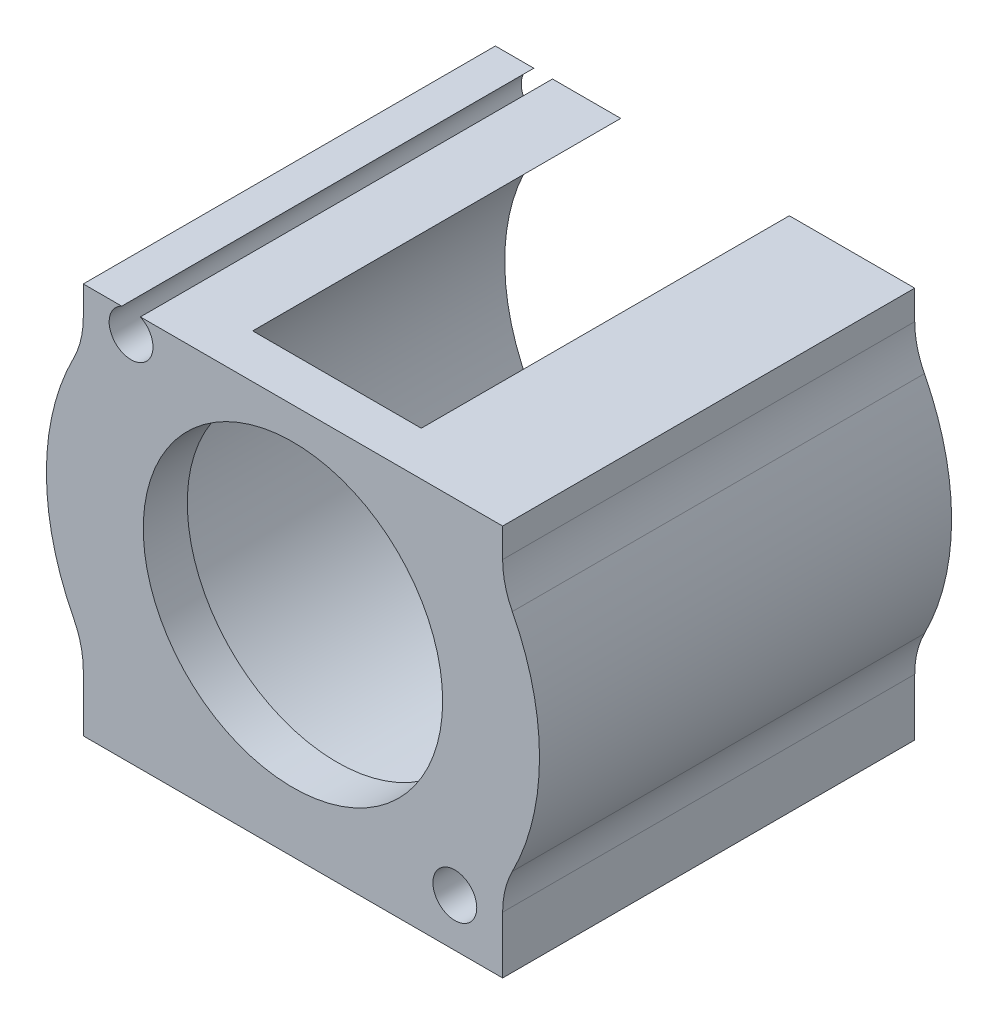
ISO-10303-21;
HEADER;
FILE_DESCRIPTION(('STEP AP214'),'2;1');
FILE_NAME('part.step','',(''),(''),'','','');
FILE_SCHEMA(('AUTOMOTIVE_DESIGN { 1 0 10303 214 1 1 1 1 }'));
ENDSEC;
DATA;
#1=APPLICATION_CONTEXT('core data for automotive mechanical design processes');
#2=APPLICATION_PROTOCOL_DEFINITION('international standard','automotive_design',2000,#1);
#3=PRODUCT_CONTEXT('',#1,'mechanical');
#4=PRODUCT('Part','Part','',(#3));
#5=PRODUCT_RELATED_PRODUCT_CATEGORY('part','',(#4));
#6=PRODUCT_DEFINITION_FORMATION('','',#4);
#7=PRODUCT_DEFINITION_CONTEXT('part definition',#1,'design');
#8=PRODUCT_DEFINITION('design','',#6,#7);
#9=PRODUCT_DEFINITION_SHAPE('','',#8);
#10=(LENGTH_UNIT() NAMED_UNIT(*) SI_UNIT(.MILLI.,.METRE.));
#11=(NAMED_UNIT(*) PLANE_ANGLE_UNIT() SI_UNIT($,.RADIAN.));
#12=(NAMED_UNIT(*) SI_UNIT($,.STERADIAN.) SOLID_ANGLE_UNIT());
#13=UNCERTAINTY_MEASURE_WITH_UNIT(LENGTH_MEASURE(1.E-05),#10,'distance_accuracy_value','');
#14=(GEOMETRIC_REPRESENTATION_CONTEXT(3) GLOBAL_UNCERTAINTY_ASSIGNED_CONTEXT((#13)) GLOBAL_UNIT_ASSIGNED_CONTEXT((#10,
#11,#12)) REPRESENTATION_CONTEXT('',''));
#15=CARTESIAN_POINT('',(0.,0.,0.));
#16=DIRECTION('',(0.,0.,1.));
#17=DIRECTION('',(1.,0.,0.));
#18=AXIS2_PLACEMENT_3D('',#15,#16,#17);
#19=CARTESIAN_POINT('',(0.,0.,46.8));
#20=DIRECTION('',(0.,0.,-1.));
#21=DIRECTION('',(-1.,0.,0.));
#22=AXIS2_PLACEMENT_3D('',#19,#20,#21);
#23=CYLINDRICAL_SURFACE('',#22,22.75);
#24=DIRECTION('',(0.,0.,-1.));
#25=VECTOR('',#24,1.);
#26=CARTESIAN_POINT('',(-9.57371890907607,20.6375,46.8));
#27=LINE('',#26,#25);
#28=CARTESIAN_POINT('',(-9.57371890907607,20.6375,41.8));
#29=VERTEX_POINT('',#28);
#30=CARTESIAN_POINT('',(-9.57371890907607,20.6375,0.));
#31=VERTEX_POINT('',#30);
#32=EDGE_CURVE('E164',#29,#31,#27,.T.);
#33=ORIENTED_EDGE('',*,*,#32,.F.);
#34=CARTESIAN_POINT('',(0.,0.,41.8));
#35=DIRECTION('',(0.,0.,1.));
#36=DIRECTION('',(1.,0.,0.));
#37=AXIS2_PLACEMENT_3D('',#34,#35,#36);
#38=CIRCLE('',#37,22.75);
#39=CARTESIAN_POINT('',(9.57371890907606,20.6375,41.8));
#40=VERTEX_POINT('',#39);
#41=EDGE_CURVE('E152',#29,#40,#38,.T.);
#42=ORIENTED_EDGE('',*,*,#41,.T.);
#43=DIRECTION('',(0.,0.,-1.));
#44=VECTOR('',#43,1.);
#45=CARTESIAN_POINT('',(9.57371890907606,20.6375,46.8));
#46=LINE('',#45,#44);
#47=CARTESIAN_POINT('',(9.57371890907606,20.6375,0.));
#48=VERTEX_POINT('',#47);
#49=EDGE_CURVE('E162',#48,#40,#46,.F.);
#50=ORIENTED_EDGE('',*,*,#49,.F.);
#51=CARTESIAN_POINT('',(0.,0.,0.));
#52=DIRECTION('',(0.,0.,1.));
#53=DIRECTION('',(1.,0.,0.));
#54=AXIS2_PLACEMENT_3D('',#51,#52,#53);
#55=CIRCLE('',#54,22.75);
#56=EDGE_CURVE('E190',#31,#48,#55,.T.);
#57=ORIENTED_EDGE('',*,*,#56,.F.);
#58=EDGE_LOOP('',(#33,#42,#50,#57));
#59=FACE_BOUND('',#58,.T.);
#60=ADVANCED_FACE('F39',(#59),#23,.F.);
#61=CARTESIAN_POINT('',(23.8125,-23.8125,46.8));
#62=DIRECTION('',(-1.,0.,0.));
#63=DIRECTION('',(0.,0.,1.));
#64=AXIS2_PLACEMENT_3D('',#61,#62,#63);
#65=PLANE('',#64);
#66=DIRECTION('',(0.,1.,0.));
#67=VECTOR('',#66,1.);
#68=CARTESIAN_POINT('',(23.8125,-23.8125,0.));
#69=LINE('',#68,#67);
#70=CARTESIAN_POINT('',(23.8125,-23.8125,0.));
#71=VERTEX_POINT('',#70);
#72=CARTESIAN_POINT('',(23.8125,-17.3411315590996,0.));
#73=VERTEX_POINT('',#72);
#74=EDGE_CURVE('E209',#71,#73,#69,.T.);
#75=ORIENTED_EDGE('',*,*,#74,.T.);
#76=DIRECTION('',(0.,0.,1.));
#77=VECTOR('',#76,1.);
#78=CARTESIAN_POINT('',(23.8125,-17.3411315590996,46.8));
#79=LINE('',#78,#77);
#80=CARTESIAN_POINT('',(23.8125,-17.3411315590996,46.8));
#81=VERTEX_POINT('',#80);
#82=EDGE_CURVE('E226',#73,#81,#79,.T.);
#83=ORIENTED_EDGE('',*,*,#82,.T.);
#84=DIRECTION('',(0.,1.,0.));
#85=VECTOR('',#84,1.);
#86=CARTESIAN_POINT('',(23.8125,-23.8125,46.8));
#87=LINE('',#86,#85);
#88=CARTESIAN_POINT('',(23.8125,-23.8125,46.8));
#89=VERTEX_POINT('',#88);
#90=EDGE_CURVE('E203',#89,#81,#87,.T.);
#91=ORIENTED_EDGE('',*,*,#90,.F.);
#92=DIRECTION('',(0.,0.,-1.));
#93=VECTOR('',#92,1.);
#94=CARTESIAN_POINT('',(23.8125,-23.8125,46.8));
#95=LINE('',#94,#93);
#96=EDGE_CURVE('E204',#89,#71,#95,.T.);
#97=ORIENTED_EDGE('',*,*,#96,.T.);
#98=EDGE_LOOP('',(#75,#83,#91,#97));
#99=FACE_BOUND('',#98,.T.);
#100=ADVANCED_FACE('F330',(#99),#65,.F.);
#101=CARTESIAN_POINT('',(-23.8125,-23.8125,46.8));
#102=DIRECTION('',(1.,0.,0.));
#103=DIRECTION('',(0.,0.,-1.));
#104=AXIS2_PLACEMENT_3D('',#101,#102,#103);
#105=PLANE('',#104);
#106=DIRECTION('',(0.,-1.,0.));
#107=VECTOR('',#106,1.);
#108=CARTESIAN_POINT('',(-23.8125,-23.8125,0.));
#109=LINE('',#108,#107);
#110=CARTESIAN_POINT('',(-23.8125,20.6375,0.));
#111=VERTEX_POINT('',#110);
#112=CARTESIAN_POINT('',(-23.8125,17.3411315590996,0.));
#113=VERTEX_POINT('',#112);
#114=EDGE_CURVE('E202',#111,#113,#109,.T.);
#115=ORIENTED_EDGE('',*,*,#114,.T.);
#116=DIRECTION('',(0.,0.,1.));
#117=VECTOR('',#116,1.);
#118=CARTESIAN_POINT('',(-23.8125,17.3411315590996,46.8));
#119=LINE('',#118,#117);
#120=CARTESIAN_POINT('',(-23.8125,17.3411315590996,46.8));
#121=VERTEX_POINT('',#120);
#122=EDGE_CURVE('E238',#113,#121,#119,.T.);
#123=ORIENTED_EDGE('',*,*,#122,.T.);
#124=DIRECTION('',(0.,-1.,0.));
#125=VECTOR('',#124,1.);
#126=CARTESIAN_POINT('',(-23.8125,-23.8125,46.8));
#127=LINE('',#126,#125);
#128=CARTESIAN_POINT('',(-23.8125,20.6375,46.8));
#129=VERTEX_POINT('',#128);
#130=EDGE_CURVE('E195',#129,#121,#127,.T.);
#131=ORIENTED_EDGE('',*,*,#130,.F.);
#132=DIRECTION('',(0.,0.,1.));
#133=VECTOR('',#132,1.);
#134=CARTESIAN_POINT('',(-23.8125,20.6375,0.));
#135=LINE('',#134,#133);
#136=EDGE_CURVE('E271',#111,#129,#135,.T.);
#137=ORIENTED_EDGE('',*,*,#136,.F.);
#138=EDGE_LOOP('',(#115,#123,#131,#137));
#139=FACE_BOUND('',#138,.T.);
#140=ADVANCED_FACE('F267',(#139),#105,.F.);
#141=CARTESIAN_POINT('',(0.,0.,46.8));
#142=DIRECTION('',(0.,0.,1.));
#143=DIRECTION('',(1.,0.,0.));
#144=AXIS2_PLACEMENT_3D('',#141,#142,#143);
#145=PLANE('',#144);
#146=DIRECTION('',(1.,0.,0.));
#147=VECTOR('',#146,1.);
#148=CARTESIAN_POINT('',(0.,20.6375,46.8));
#149=LINE('',#148,#147);
#150=CARTESIAN_POINT('',(-19.4437156954911,20.6375,46.8));
#151=VERTEX_POINT('',#150);
#152=EDGE_CURVE('E175',#129,#151,#149,.T.);
#153=ORIENTED_EDGE('',*,*,#152,.F.);
#154=ORIENTED_EDGE('',*,*,#130,.T.);
#155=CARTESIAN_POINT('',(-33.8125,17.3411315590996,46.8));
#156=DIRECTION('',(0.,0.,1.));
#157=DIRECTION('',(1.,0.,0.));
#158=AXIS2_PLACEMENT_3D('',#155,#156,#157);
#159=CIRCLE('',#158,10.);
#160=CARTESIAN_POINT('',(-24.9144736842105,12.7776758856523,46.8));
#161=VERTEX_POINT('',#160);
#162=EDGE_CURVE('E50',#121,#161,#159,.F.);
#163=ORIENTED_EDGE('',*,*,#162,.T.);
#164=CARTESIAN_POINT('',(0.,0.,46.8));
#165=DIRECTION('',(0.,0.,1.));
#166=DIRECTION('',(1.,0.,0.));
#167=AXIS2_PLACEMENT_3D('',#164,#165,#166);
#168=CIRCLE('',#167,28.);
#169=CARTESIAN_POINT('',(-24.9144736842105,-12.7776758856523,46.8));
#170=VERTEX_POINT('',#169);
#171=EDGE_CURVE('E259',#161,#170,#168,.T.);
#172=ORIENTED_EDGE('',*,*,#171,.T.);
#173=CARTESIAN_POINT('',(-33.8125,-17.3411315590996,46.8));
#174=DIRECTION('',(0.,0.,1.));
#175=DIRECTION('',(1.,0.,0.));
#176=AXIS2_PLACEMENT_3D('',#173,#174,#175);
#177=CIRCLE('',#176,10.);
#178=CARTESIAN_POINT('',(-23.8125,-17.3411315590996,46.8));
#179=VERTEX_POINT('',#178);
#180=EDGE_CURVE('E246',#170,#179,#177,.F.);
#181=ORIENTED_EDGE('',*,*,#180,.T.);
#182=CARTESIAN_POINT('',(-23.8125,-23.8125,46.8));
#183=VERTEX_POINT('',#182);
#184=EDGE_CURVE('E196',#179,#183,#127,.T.);
#185=ORIENTED_EDGE('',*,*,#184,.T.);
#186=DIRECTION('',(1.,0.,0.));
#187=VECTOR('',#186,1.);
#188=CARTESIAN_POINT('',(23.8125,-23.8125,46.8));
#189=LINE('',#188,#187);
#190=EDGE_CURVE('E197',#183,#89,#189,.T.);
#191=ORIENTED_EDGE('',*,*,#190,.T.);
#192=ORIENTED_EDGE('',*,*,#90,.T.);
#193=CARTESIAN_POINT('',(33.8125,-17.3411315590996,46.8));
#194=DIRECTION('',(0.,0.,1.));
#195=DIRECTION('',(1.,0.,0.));
#196=AXIS2_PLACEMENT_3D('',#193,#194,#195);
#197=CIRCLE('',#196,10.);
#198=CARTESIAN_POINT('',(24.9144736842105,-12.7776758856523,46.8));
#199=VERTEX_POINT('',#198);
#200=EDGE_CURVE('E248',#81,#199,#197,.F.);
#201=ORIENTED_EDGE('',*,*,#200,.T.);
#202=CARTESIAN_POINT('',(0.,0.,46.8));
#203=DIRECTION('',(0.,0.,1.));
#204=DIRECTION('',(1.,0.,0.));
#205=AXIS2_PLACEMENT_3D('',#202,#203,#204);
#206=CIRCLE('',#205,28.);
#207=CARTESIAN_POINT('',(24.9144736842105,12.7776758856523,46.8));
#208=VERTEX_POINT('',#207);
#209=EDGE_CURVE('E266',#199,#208,#206,.T.);
#210=ORIENTED_EDGE('',*,*,#209,.T.);
#211=CARTESIAN_POINT('',(33.8125,17.3411315590996,46.8));
#212=DIRECTION('',(0.,0.,1.));
#213=DIRECTION('',(1.,0.,0.));
#214=AXIS2_PLACEMENT_3D('',#211,#212,#213);
#215=CIRCLE('',#214,10.);
#216=CARTESIAN_POINT('',(23.8125,17.3411315590996,46.8));
#217=VERTEX_POINT('',#216);
#218=EDGE_CURVE('E244',#208,#217,#215,.F.);
#219=ORIENTED_EDGE('',*,*,#218,.T.);
#220=CARTESIAN_POINT('',(23.8125,20.6375,46.8));
#221=VERTEX_POINT('',#220);
#222=EDGE_CURVE('E199',#217,#221,#87,.T.);
#223=ORIENTED_EDGE('',*,*,#222,.T.);
#224=CARTESIAN_POINT('',(-17.3258369262094,20.6375,46.8));
#225=VERTEX_POINT('',#224);
#226=EDGE_CURVE('E172',#225,#221,#149,.T.);
#227=ORIENTED_EDGE('',*,*,#226,.F.);
#228=CARTESIAN_POINT('',(-18.3847763108502,18.3847763108502,46.8));
#229=DIRECTION('',(0.,0.,1.));
#230=DIRECTION('',(1.,0.,0.));
#231=AXIS2_PLACEMENT_3D('',#228,#229,#230);
#232=CIRCLE('',#231,2.4892);
#233=EDGE_CURVE('E188',#151,#225,#232,.T.);
#234=ORIENTED_EDGE('',*,*,#233,.F.);
#235=EDGE_LOOP('',(#153,#154,#163,#172,#181,#185,#191,#192,#201,#210,#219,#223,#227,#234));
#236=FACE_BOUND('',#235,.T.);
#237=CARTESIAN_POINT('',(18.3847763108502,-18.3847763108502,46.8));
#238=DIRECTION('',(0.,0.,1.));
#239=DIRECTION('',(1.,0.,0.));
#240=AXIS2_PLACEMENT_3D('',#237,#238,#239);
#241=CIRCLE('',#240,2.4892);
#242=CARTESIAN_POINT('',(20.8739763108502,-18.3847763108502,46.8));
#243=VERTEX_POINT('',#242);
#244=EDGE_CURVE('E176',#243,#243,#241,.T.);
#245=ORIENTED_EDGE('',*,*,#244,.F.);
#246=EDGE_LOOP('',(#245));
#247=FACE_BOUND('',#246,.T.);
#248=CARTESIAN_POINT('',(0.,0.,46.8));
#249=DIRECTION('',(0.,0.,1.));
#250=DIRECTION('',(1.,0.,0.));
#251=AXIS2_PLACEMENT_3D('',#248,#249,#250);
#252=CIRCLE('',#251,17.);
#253=CARTESIAN_POINT('',(17.,0.,46.8));
#254=VERTEX_POINT('',#253);
#255=EDGE_CURVE('E472',#254,#254,#252,.T.);
#256=ORIENTED_EDGE('',*,*,#255,.F.);
#257=EDGE_LOOP('',(#256));
#258=FACE_BOUND('',#257,.T.);
#259=ADVANCED_FACE('F260',(#236,#247,#258),#145,.T.);
#260=CARTESIAN_POINT('',(0.,0.,0.));
#261=DIRECTION('',(0.,0.,1.));
#262=DIRECTION('',(1.,0.,0.));
#263=AXIS2_PLACEMENT_3D('',#260,#261,#262);
#264=PLANE('',#263);
#265=ORIENTED_EDGE('',*,*,#114,.F.);
#266=DIRECTION('',(1.,0.,0.));
#267=VECTOR('',#266,1.);
#268=CARTESIAN_POINT('',(-23.8125,20.6375,0.));
#269=LINE('',#268,#267);
#270=CARTESIAN_POINT('',(-19.4437156954911,20.6375,0.));
#271=VERTEX_POINT('',#270);
#272=EDGE_CURVE('E274',#111,#271,#269,.T.);
#273=ORIENTED_EDGE('',*,*,#272,.T.);
#274=CARTESIAN_POINT('',(-18.3847763108502,18.3847763108502,0.));
#275=DIRECTION('',(0.,0.,1.));
#276=DIRECTION('',(1.,0.,0.));
#277=AXIS2_PLACEMENT_3D('',#274,#275,#276);
#278=CIRCLE('',#277,2.4892);
#279=CARTESIAN_POINT('',(-17.3258369262094,20.6375,0.));
#280=VERTEX_POINT('',#279);
#281=EDGE_CURVE('E181',#271,#280,#278,.T.);
#282=ORIENTED_EDGE('',*,*,#281,.T.);
#283=EDGE_CURVE('E276',#280,#31,#269,.T.);
#284=ORIENTED_EDGE('',*,*,#283,.T.);
#285=ORIENTED_EDGE('',*,*,#56,.T.);
#286=CARTESIAN_POINT('',(23.8125,20.6375,0.));
#287=VERTEX_POINT('',#286);
#288=EDGE_CURVE('E174',#48,#287,#269,.T.);
#289=ORIENTED_EDGE('',*,*,#288,.T.);
#290=CARTESIAN_POINT('',(23.8125,17.3411315590996,0.));
#291=VERTEX_POINT('',#290);
#292=EDGE_CURVE('E207',#291,#287,#69,.T.);
#293=ORIENTED_EDGE('',*,*,#292,.F.);
#294=CARTESIAN_POINT('',(33.8125,17.3411315590996,0.));
#295=DIRECTION('',(0.,0.,1.));
#296=DIRECTION('',(1.,0.,0.));
#297=AXIS2_PLACEMENT_3D('',#294,#295,#296);
#298=CIRCLE('',#297,10.);
#299=CARTESIAN_POINT('',(24.9144736842105,12.7776758856523,0.));
#300=VERTEX_POINT('',#299);
#301=EDGE_CURVE('E245',#291,#300,#298,.T.);
#302=ORIENTED_EDGE('',*,*,#301,.T.);
#303=CARTESIAN_POINT('',(0.,0.,0.));
#304=DIRECTION('',(0.,0.,1.));
#305=DIRECTION('',(1.,0.,0.));
#306=AXIS2_PLACEMENT_3D('',#303,#304,#305);
#307=CIRCLE('',#306,28.);
#308=CARTESIAN_POINT('',(24.9144736842105,-12.7776758856523,0.));
#309=VERTEX_POINT('',#308);
#310=EDGE_CURVE('E158',#300,#309,#307,.F.);
#311=ORIENTED_EDGE('',*,*,#310,.T.);
#312=CARTESIAN_POINT('',(33.8125,-17.3411315590996,0.));
#313=DIRECTION('',(0.,0.,1.));
#314=DIRECTION('',(1.,0.,0.));
#315=AXIS2_PLACEMENT_3D('',#312,#313,#314);
#316=CIRCLE('',#315,10.);
#317=EDGE_CURVE('E247',#309,#73,#316,.T.);
#318=ORIENTED_EDGE('',*,*,#317,.T.);
#319=ORIENTED_EDGE('',*,*,#74,.F.);
#320=DIRECTION('',(1.,0.,0.));
#321=VECTOR('',#320,1.);
#322=CARTESIAN_POINT('',(23.8125,-23.8125,0.));
#323=LINE('',#322,#321);
#324=CARTESIAN_POINT('',(-23.8125,-23.8125,0.));
#325=VERTEX_POINT('',#324);
#326=EDGE_CURVE('E210',#325,#71,#323,.T.);
#327=ORIENTED_EDGE('',*,*,#326,.F.);
#328=CARTESIAN_POINT('',(-23.8125,-17.3411315590996,0.));
#329=VERTEX_POINT('',#328);
#330=EDGE_CURVE('E192',#329,#325,#109,.T.);
#331=ORIENTED_EDGE('',*,*,#330,.F.);
#332=CARTESIAN_POINT('',(-33.8125,-17.3411315590996,0.));
#333=DIRECTION('',(0.,0.,1.));
#334=DIRECTION('',(1.,0.,0.));
#335=AXIS2_PLACEMENT_3D('',#332,#333,#334);
#336=CIRCLE('',#335,10.);
#337=CARTESIAN_POINT('',(-24.9144736842105,-12.7776758856523,0.));
#338=VERTEX_POINT('',#337);
#339=EDGE_CURVE('E252',#329,#338,#336,.T.);
#340=ORIENTED_EDGE('',*,*,#339,.T.);
#341=CARTESIAN_POINT('',(0.,0.,0.));
#342=DIRECTION('',(0.,0.,1.));
#343=DIRECTION('',(1.,0.,0.));
#344=AXIS2_PLACEMENT_3D('',#341,#342,#343);
#345=CIRCLE('',#344,28.);
#346=CARTESIAN_POINT('',(-24.9144736842105,12.7776758856523,0.));
#347=VERTEX_POINT('',#346);
#348=EDGE_CURVE('E264',#338,#347,#345,.F.);
#349=ORIENTED_EDGE('',*,*,#348,.T.);
#350=CARTESIAN_POINT('',(-33.8125,17.3411315590996,0.));
#351=DIRECTION('',(0.,0.,1.));
#352=DIRECTION('',(1.,0.,0.));
#353=AXIS2_PLACEMENT_3D('',#350,#351,#352);
#354=CIRCLE('',#353,10.);
#355=EDGE_CURVE('E11',#347,#113,#354,.T.);
#356=ORIENTED_EDGE('',*,*,#355,.T.);
#357=EDGE_LOOP('',(#265,#273,#282,#284,#285,#289,#293,#302,#311,#318,#319,#327,#331,#340,#349,#356));
#358=FACE_BOUND('',#357,.T.);
#359=CARTESIAN_POINT('',(18.3847763108502,-18.3847763108502,0.));
#360=DIRECTION('',(0.,0.,1.));
#361=DIRECTION('',(1.,0.,0.));
#362=AXIS2_PLACEMENT_3D('',#359,#360,#361);
#363=CIRCLE('',#362,2.4892);
#364=CARTESIAN_POINT('',(20.8739763108502,-18.3847763108502,0.));
#365=VERTEX_POINT('',#364);
#366=EDGE_CURVE('E178',#365,#365,#363,.T.);
#367=ORIENTED_EDGE('',*,*,#366,.T.);
#368=EDGE_LOOP('',(#367));
#369=FACE_BOUND('',#368,.T.);
#370=ADVANCED_FACE('F272',(#358,#369),#264,.F.);
#371=ORIENTED_EDGE('',*,*,#184,.F.);
#372=DIRECTION('',(0.,0.,1.));
#373=VECTOR('',#372,1.);
#374=CARTESIAN_POINT('',(-23.8125,-17.3411315590996,46.8));
#375=LINE('',#374,#373);
#376=EDGE_CURVE('E236',#179,#329,#375,.F.);
#377=ORIENTED_EDGE('',*,*,#376,.T.);
#378=ORIENTED_EDGE('',*,*,#330,.T.);
#379=DIRECTION('',(0.,0.,-1.));
#380=VECTOR('',#379,1.);
#381=CARTESIAN_POINT('',(-23.8125,-23.8125,46.8));
#382=LINE('',#381,#380);
#383=EDGE_CURVE('E214',#183,#325,#382,.T.);
#384=ORIENTED_EDGE('',*,*,#383,.F.);
#385=EDGE_LOOP('',(#371,#377,#378,#384));
#386=FACE_BOUND('',#385,.T.);
#387=ADVANCED_FACE('F319',(#386),#105,.F.);
#388=CARTESIAN_POINT('',(23.8125,-23.8125,46.8));
#389=DIRECTION('',(0.,1.,0.));
#390=DIRECTION('',(-1.,0.,0.));
#391=AXIS2_PLACEMENT_3D('',#388,#389,#390);
#392=PLANE('',#391);
#393=ORIENTED_EDGE('',*,*,#326,.T.);
#394=ORIENTED_EDGE('',*,*,#96,.F.);
#395=ORIENTED_EDGE('',*,*,#190,.F.);
#396=ORIENTED_EDGE('',*,*,#383,.T.);
#397=EDGE_LOOP('',(#393,#394,#395,#396));
#398=FACE_BOUND('',#397,.T.);
#399=ADVANCED_FACE('F323',(#398),#392,.F.);
#400=ORIENTED_EDGE('',*,*,#222,.F.);
#401=DIRECTION('',(0.,0.,1.));
#402=VECTOR('',#401,1.);
#403=CARTESIAN_POINT('',(23.8125,17.3411315590996,46.8));
#404=LINE('',#403,#402);
#405=EDGE_CURVE('E227',#217,#291,#404,.F.);
#406=ORIENTED_EDGE('',*,*,#405,.T.);
#407=ORIENTED_EDGE('',*,*,#292,.T.);
#408=DIRECTION('',(0.,0.,1.));
#409=VECTOR('',#408,1.);
#410=CARTESIAN_POINT('',(23.8125,20.6375,0.));
#411=LINE('',#410,#409);
#412=EDGE_CURVE('E290',#287,#221,#411,.T.);
#413=ORIENTED_EDGE('',*,*,#412,.T.);
#414=EDGE_LOOP('',(#400,#406,#407,#413));
#415=FACE_BOUND('',#414,.T.);
#416=ADVANCED_FACE('F298',(#415),#65,.F.);
#417=CARTESIAN_POINT('',(-18.3847763108502,18.3847763108502,46.8));
#418=DIRECTION('',(0.,0.,-1.));
#419=DIRECTION('',(-1.,0.,0.));
#420=AXIS2_PLACEMENT_3D('',#417,#418,#419);
#421=CYLINDRICAL_SURFACE('',#420,2.4892);
#422=DIRECTION('',(0.,0.,-1.));
#423=VECTOR('',#422,1.);
#424=CARTESIAN_POINT('',(-19.4437156954911,20.6375,46.8));
#425=LINE('',#424,#423);
#426=EDGE_CURVE('E222',#151,#271,#425,.T.);
#427=ORIENTED_EDGE('',*,*,#426,.F.);
#428=ORIENTED_EDGE('',*,*,#233,.T.);
#429=DIRECTION('',(0.,0.,-1.));
#430=VECTOR('',#429,1.);
#431=CARTESIAN_POINT('',(-17.3258369262094,20.6375,46.8));
#432=LINE('',#431,#430);
#433=EDGE_CURVE('E217',#280,#225,#432,.F.);
#434=ORIENTED_EDGE('',*,*,#433,.F.);
#435=ORIENTED_EDGE('',*,*,#281,.F.);
#436=EDGE_LOOP('',(#427,#428,#434,#435));
#437=FACE_BOUND('',#436,.T.);
#438=ADVANCED_FACE('F285',(#437),#421,.F.);
#439=CARTESIAN_POINT('',(18.3847763108502,-18.3847763108502,46.8));
#440=DIRECTION('',(0.,0.,-1.));
#441=DIRECTION('',(-1.,0.,0.));
#442=AXIS2_PLACEMENT_3D('',#439,#440,#441);
#443=CYLINDRICAL_SURFACE('',#442,2.4892);
#444=ORIENTED_EDGE('',*,*,#244,.T.);
#445=EDGE_LOOP('',(#444));
#446=FACE_BOUND('',#445,.T.);
#447=ORIENTED_EDGE('',*,*,#366,.F.);
#448=EDGE_LOOP('',(#447));
#449=FACE_BOUND('',#448,.T.);
#450=ADVANCED_FACE('F458',(#446,#449),#443,.F.);
#451=CARTESIAN_POINT('',(-23.8125,20.6375,0.));
#452=DIRECTION('',(0.,-1.,0.));
#453=DIRECTION('',(0.,0.,-1.));
#454=AXIS2_PLACEMENT_3D('',#451,#452,#453);
#455=PLANE('',#454);
#456=ORIENTED_EDGE('',*,*,#152,.T.);
#457=ORIENTED_EDGE('',*,*,#426,.T.);
#458=ORIENTED_EDGE('',*,*,#272,.F.);
#459=ORIENTED_EDGE('',*,*,#136,.T.);
#460=EDGE_LOOP('',(#456,#457,#458,#459));
#461=FACE_BOUND('',#460,.T.);
#462=ADVANCED_FACE('F292',(#461),#455,.F.);
#463=ORIENTED_EDGE('',*,*,#226,.T.);
#464=ORIENTED_EDGE('',*,*,#412,.F.);
#465=ORIENTED_EDGE('',*,*,#288,.F.);
#466=ORIENTED_EDGE('',*,*,#49,.T.);
#467=DIRECTION('',(-1.,0.,0.));
#468=VECTOR('',#467,1.);
#469=CARTESIAN_POINT('',(-9.57371890907607,20.6375,41.8));
#470=LINE('',#469,#468);
#471=EDGE_CURVE('E151',#40,#29,#470,.T.);
#472=ORIENTED_EDGE('',*,*,#471,.T.);
#473=ORIENTED_EDGE('',*,*,#32,.T.);
#474=ORIENTED_EDGE('',*,*,#283,.F.);
#475=ORIENTED_EDGE('',*,*,#433,.T.);
#476=EDGE_LOOP('',(#463,#464,#465,#466,#472,#473,#474,#475));
#477=FACE_BOUND('',#476,.T.);
#478=ADVANCED_FACE('F166',(#477),#455,.F.);
#479=CARTESIAN_POINT('',(0.,0.,-29.7555798338732));
#480=DIRECTION('',(0.,0.,1.));
#481=DIRECTION('',(1.,0.,0.));
#482=AXIS2_PLACEMENT_3D('',#479,#480,#481);
#483=CYLINDRICAL_SURFACE('',#482,28.);
#484=ORIENTED_EDGE('',*,*,#348,.F.);
#485=DIRECTION('',(0.,0.,1.));
#486=VECTOR('',#485,1.);
#487=CARTESIAN_POINT('',(-24.9144736842105,-12.7776758856523,-29.7555798338732));
#488=LINE('',#487,#486);
#489=EDGE_CURVE('E231',#338,#170,#488,.T.);
#490=ORIENTED_EDGE('',*,*,#489,.T.);
#491=ORIENTED_EDGE('',*,*,#171,.F.);
#492=DIRECTION('',(0.,0.,1.));
#493=VECTOR('',#492,1.);
#494=CARTESIAN_POINT('',(-24.9144736842105,12.7776758856523,-29.7555798338732));
#495=LINE('',#494,#493);
#496=EDGE_CURVE('E232',#161,#347,#495,.F.);
#497=ORIENTED_EDGE('',*,*,#496,.T.);
#498=EDGE_LOOP('',(#484,#490,#491,#497));
#499=FACE_BOUND('',#498,.T.);
#500=ADVANCED_FACE('F263',(#499),#483,.T.);
#501=CARTESIAN_POINT('',(0.,0.,-29.7555798338732));
#502=DIRECTION('',(0.,0.,1.));
#503=DIRECTION('',(1.,0.,0.));
#504=AXIS2_PLACEMENT_3D('',#501,#502,#503);
#505=CYLINDRICAL_SURFACE('',#504,28.);
#506=ORIENTED_EDGE('',*,*,#310,.F.);
#507=DIRECTION('',(0.,0.,1.));
#508=VECTOR('',#507,1.);
#509=CARTESIAN_POINT('',(24.9144736842105,12.7776758856523,-29.7555798338732));
#510=LINE('',#509,#508);
#511=EDGE_CURVE('E223',#300,#208,#510,.T.);
#512=ORIENTED_EDGE('',*,*,#511,.T.);
#513=ORIENTED_EDGE('',*,*,#209,.F.);
#514=DIRECTION('',(0.,0.,1.));
#515=VECTOR('',#514,1.);
#516=CARTESIAN_POINT('',(24.9144736842105,-12.7776758856523,-29.7555798338732));
#517=LINE('',#516,#515);
#518=EDGE_CURVE('E224',#199,#309,#517,.F.);
#519=ORIENTED_EDGE('',*,*,#518,.T.);
#520=EDGE_LOOP('',(#506,#512,#513,#519));
#521=FACE_BOUND('',#520,.T.);
#522=ADVANCED_FACE('F308',(#521),#505,.T.);
#523=CARTESIAN_POINT('',(33.8125,17.3411315590996,-29.7555798338732));
#524=DIRECTION('',(0.,0.,1.));
#525=DIRECTION('',(1.,0.,0.));
#526=AXIS2_PLACEMENT_3D('',#523,#524,#525);
#527=CYLINDRICAL_SURFACE('',#526,10.);
#528=ORIENTED_EDGE('',*,*,#301,.F.);
#529=ORIENTED_EDGE('',*,*,#405,.F.);
#530=ORIENTED_EDGE('',*,*,#218,.F.);
#531=ORIENTED_EDGE('',*,*,#511,.F.);
#532=EDGE_LOOP('',(#528,#529,#530,#531));
#533=FACE_BOUND('',#532,.T.);
#534=ADVANCED_FACE('F296',(#533),#527,.F.);
#535=CARTESIAN_POINT('',(33.8125,-17.3411315590996,-29.7555798338732));
#536=DIRECTION('',(0.,0.,1.));
#537=DIRECTION('',(1.,0.,0.));
#538=AXIS2_PLACEMENT_3D('',#535,#536,#537);
#539=CYLINDRICAL_SURFACE('',#538,10.);
#540=ORIENTED_EDGE('',*,*,#317,.F.);
#541=ORIENTED_EDGE('',*,*,#518,.F.);
#542=ORIENTED_EDGE('',*,*,#200,.F.);
#543=ORIENTED_EDGE('',*,*,#82,.F.);
#544=EDGE_LOOP('',(#540,#541,#542,#543));
#545=FACE_BOUND('',#544,.T.);
#546=ADVANCED_FACE('F332',(#545),#539,.F.);
#547=CARTESIAN_POINT('',(-33.8125,-17.3411315590996,-29.7555798338732));
#548=DIRECTION('',(0.,0.,1.));
#549=DIRECTION('',(1.,0.,0.));
#550=AXIS2_PLACEMENT_3D('',#547,#548,#549);
#551=CYLINDRICAL_SURFACE('',#550,10.);
#552=ORIENTED_EDGE('',*,*,#339,.F.);
#553=ORIENTED_EDGE('',*,*,#376,.F.);
#554=ORIENTED_EDGE('',*,*,#180,.F.);
#555=ORIENTED_EDGE('',*,*,#489,.F.);
#556=EDGE_LOOP('',(#552,#553,#554,#555));
#557=FACE_BOUND('',#556,.T.);
#558=ADVANCED_FACE('F314',(#557),#551,.F.);
#559=CARTESIAN_POINT('',(-33.8125,17.3411315590996,-29.7555798338732));
#560=DIRECTION('',(0.,0.,1.));
#561=DIRECTION('',(1.,0.,0.));
#562=AXIS2_PLACEMENT_3D('',#559,#560,#561);
#563=CYLINDRICAL_SURFACE('',#562,10.);
#564=ORIENTED_EDGE('',*,*,#355,.F.);
#565=ORIENTED_EDGE('',*,*,#496,.F.);
#566=ORIENTED_EDGE('',*,*,#162,.F.);
#567=ORIENTED_EDGE('',*,*,#122,.F.);
#568=EDGE_LOOP('',(#564,#565,#566,#567));
#569=FACE_BOUND('',#568,.T.);
#570=ADVANCED_FACE('F41',(#569),#563,.F.);
#571=CARTESIAN_POINT('',(0.,0.,41.8));
#572=DIRECTION('',(0.,0.,1.));
#573=DIRECTION('',(1.,0.,0.));
#574=AXIS2_PLACEMENT_3D('',#571,#572,#573);
#575=PLANE('',#574);
#576=CARTESIAN_POINT('',(0.,0.,41.8));
#577=DIRECTION('',(0.,0.,1.));
#578=DIRECTION('',(1.,0.,0.));
#579=AXIS2_PLACEMENT_3D('',#576,#577,#578);
#580=CIRCLE('',#579,17.);
#581=CARTESIAN_POINT('',(17.,0.,41.8));
#582=VERTEX_POINT('',#581);
#583=EDGE_CURVE('E167',#582,#582,#580,.T.);
#584=ORIENTED_EDGE('',*,*,#583,.T.);
#585=EDGE_LOOP('',(#584));
#586=FACE_BOUND('',#585,.T.);
#587=ORIENTED_EDGE('',*,*,#41,.F.);
#588=ORIENTED_EDGE('',*,*,#471,.F.);
#589=EDGE_LOOP('',(#587,#588));
#590=FACE_BOUND('',#589,.T.);
#591=ADVANCED_FACE('F153',(#586,#590),#575,.F.);
#592=CARTESIAN_POINT('',(0.,0.,41.8));
#593=DIRECTION('',(0.,0.,1.));
#594=DIRECTION('',(1.,0.,0.));
#595=AXIS2_PLACEMENT_3D('',#592,#593,#594);
#596=CYLINDRICAL_SURFACE('',#595,17.);
#597=ORIENTED_EDGE('',*,*,#583,.F.);
#598=EDGE_LOOP('',(#597));
#599=FACE_BOUND('',#598,.T.);
#600=ORIENTED_EDGE('',*,*,#255,.T.);
#601=EDGE_LOOP('',(#600));
#602=FACE_BOUND('',#601,.T.);
#603=ADVANCED_FACE('F441',(#599,#602),#596,.F.);
#604=CLOSED_SHELL('',(#60,#100,#140,#259,#370,#387,#399,#416,#438,#450,#462,#478,#500,#522,#534,
#546,#558,#570,#591,#603));
#605=MANIFOLD_SOLID_BREP('B2',#604);
#606=ADVANCED_BREP_SHAPE_REPRESENTATION('',(#18,#605),#14);
#607=SHAPE_DEFINITION_REPRESENTATION(#9,#606);
ENDSEC;
END-ISO-10303-21;
